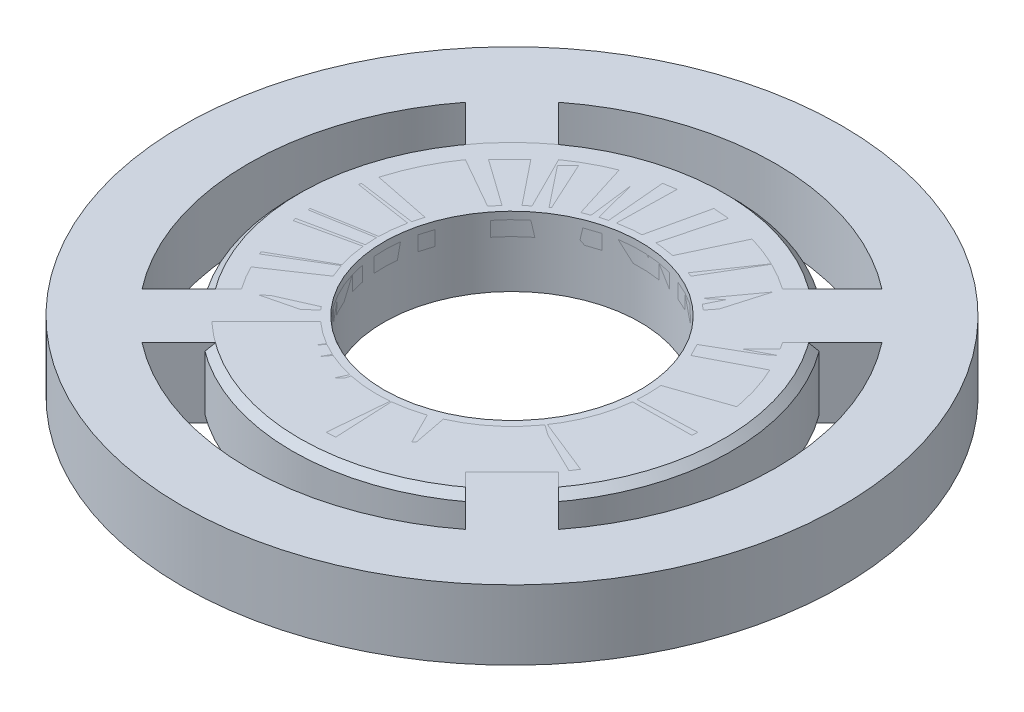
ISO-10303-21;
HEADER;
FILE_DESCRIPTION(('STEP AP214'),'2;1');
FILE_NAME('part.step','',(''),(''),'','','');
FILE_SCHEMA(('AUTOMOTIVE_DESIGN { 1 0 10303 214 1 1 1 1 }'));
ENDSEC;
DATA;
#1=APPLICATION_CONTEXT('core data for automotive mechanical design processes');
#2=APPLICATION_PROTOCOL_DEFINITION('international standard','automotive_design',2000,#1);
#3=PRODUCT_CONTEXT('',#1,'mechanical');
#4=PRODUCT('Part','Part','',(#3));
#5=PRODUCT_RELATED_PRODUCT_CATEGORY('part','',(#4));
#6=PRODUCT_DEFINITION_FORMATION('','',#4);
#7=PRODUCT_DEFINITION_CONTEXT('part definition',#1,'design');
#8=PRODUCT_DEFINITION('design','',#6,#7);
#9=PRODUCT_DEFINITION_SHAPE('','',#8);
#10=(LENGTH_UNIT() NAMED_UNIT(*) SI_UNIT(.MILLI.,.METRE.));
#11=(NAMED_UNIT(*) PLANE_ANGLE_UNIT() SI_UNIT($,.RADIAN.));
#12=(NAMED_UNIT(*) SI_UNIT($,.STERADIAN.) SOLID_ANGLE_UNIT());
#13=UNCERTAINTY_MEASURE_WITH_UNIT(LENGTH_MEASURE(1.E-05),#10,'distance_accuracy_value','');
#14=(GEOMETRIC_REPRESENTATION_CONTEXT(3) GLOBAL_UNCERTAINTY_ASSIGNED_CONTEXT((#13)) GLOBAL_UNIT_ASSIGNED_CONTEXT((#10,
#11,#12)) REPRESENTATION_CONTEXT('',''));
#15=CARTESIAN_POINT('',(0.,0.,0.));
#16=DIRECTION('',(0.,0.,1.));
#17=DIRECTION('',(1.,0.,0.));
#18=AXIS2_PLACEMENT_3D('',#15,#16,#17);
#19=CARTESIAN_POINT('',(0.,3.,0.));
#20=DIRECTION('',(0.,1.,0.));
#21=DIRECTION('',(0.,0.,1.));
#22=AXIS2_PLACEMENT_3D('',#19,#20,#21);
#23=PLANE('',#22);
#24=CARTESIAN_POINT('',(0.,3.,0.));
#25=DIRECTION('',(0.,1.,0.));
#26=DIRECTION('',(0.,0.,1.));
#27=AXIS2_PLACEMENT_3D('',#24,#25,#26);
#28=CIRCLE('',#27,17.5);
#29=CARTESIAN_POINT('',(0.,3.,17.5));
#30=VERTEX_POINT('',#29);
#31=EDGE_CURVE('E95',#30,#30,#28,.T.);
#32=ORIENTED_EDGE('',*,*,#31,.F.);
#33=EDGE_LOOP('',(#32));
#34=FACE_BOUND('',#33,.T.);
#35=CARTESIAN_POINT('',(0.,3.,0.));
#36=DIRECTION('',(0.,1.,0.));
#37=DIRECTION('',(0.,0.,1.));
#38=AXIS2_PLACEMENT_3D('',#35,#36,#37);
#39=CIRCLE('',#38,25.);
#40=CARTESIAN_POINT('',(0.,3.,25.));
#41=VERTEX_POINT('',#40);
#42=EDGE_CURVE('E92',#41,#41,#39,.F.);
#43=ORIENTED_EDGE('',*,*,#42,.F.);
#44=EDGE_LOOP('',(#43));
#45=FACE_BOUND('',#44,.T.);
#46=ADVANCED_FACE('F59',(#34,#45),#23,.T.);
#47=CARTESIAN_POINT('',(0.,0.,0.));
#48=DIRECTION('',(0.,1.,0.));
#49=DIRECTION('',(0.,0.,1.));
#50=AXIS2_PLACEMENT_3D('',#47,#48,#49);
#51=PLANE('',#50);
#52=CARTESIAN_POINT('',(0.,0.,0.));
#53=DIRECTION('',(0.,1.,0.));
#54=DIRECTION('',(0.,0.,1.));
#55=AXIS2_PLACEMENT_3D('',#52,#53,#54);
#56=CIRCLE('',#55,18.5);
#57=CARTESIAN_POINT('',(0.,0.,18.5));
#58=VERTEX_POINT('',#57);
#59=EDGE_CURVE('E75',#58,#58,#56,.T.);
#60=ORIENTED_EDGE('',*,*,#59,.T.);
#61=EDGE_LOOP('',(#60));
#62=FACE_BOUND('',#61,.T.);
#63=CARTESIAN_POINT('',(0.,0.,0.));
#64=DIRECTION('',(0.,1.,0.));
#65=DIRECTION('',(0.,0.,1.));
#66=AXIS2_PLACEMENT_3D('',#63,#64,#65);
#67=CIRCLE('',#66,29.);
#68=CARTESIAN_POINT('',(0.,0.,29.));
#69=VERTEX_POINT('',#68);
#70=EDGE_CURVE('E80',#69,#69,#67,.F.);
#71=ORIENTED_EDGE('',*,*,#70,.T.);
#72=EDGE_LOOP('',(#71));
#73=FACE_BOUND('',#72,.T.);
#74=ADVANCED_FACE('F123',(#62,#73),#51,.F.);
#75=CARTESIAN_POINT('',(0.,3.,0.));
#76=DIRECTION('',(0.,-1.,0.));
#77=DIRECTION('',(0.,0.,-1.));
#78=AXIS2_PLACEMENT_3D('',#75,#76,#77);
#79=CYLINDRICAL_SURFACE('',#78,30.);
#80=CARTESIAN_POINT('',(0.,1.00000000000001,0.));
#81=DIRECTION('',(0.,1.,0.));
#82=DIRECTION('',(0.,0.,1.));
#83=AXIS2_PLACEMENT_3D('',#80,#81,#82);
#84=CIRCLE('',#83,30.);
#85=CARTESIAN_POINT('',(0.,1.00000000000001,30.));
#86=VERTEX_POINT('',#85);
#87=EDGE_CURVE('E83',#86,#86,#84,.T.);
#88=ORIENTED_EDGE('',*,*,#87,.T.);
#89=EDGE_LOOP('',(#88));
#90=FACE_BOUND('',#89,.T.);
#91=CARTESIAN_POINT('',(0.,8.5,0.));
#92=DIRECTION('',(0.,1.,0.));
#93=DIRECTION('',(0.,0.,1.));
#94=AXIS2_PLACEMENT_3D('',#91,#92,#93);
#95=CIRCLE('',#94,30.);
#96=CARTESIAN_POINT('',(0.,8.5,30.));
#97=VERTEX_POINT('',#96);
#98=EDGE_CURVE('E86',#97,#97,#95,.F.);
#99=ORIENTED_EDGE('',*,*,#98,.T.);
#100=EDGE_LOOP('',(#99));
#101=FACE_BOUND('',#100,.T.);
#102=ADVANCED_FACE('F130',(#90,#101),#79,.T.);
#103=CARTESIAN_POINT('',(0.,3.,0.));
#104=DIRECTION('',(0.,-1.,0.));
#105=DIRECTION('',(0.,0.,-1.));
#106=AXIS2_PLACEMENT_3D('',#103,#104,#105);
#107=CYLINDRICAL_SURFACE('',#106,17.5);
#108=CARTESIAN_POINT('',(0.,0.999999999999994,0.));
#109=DIRECTION('',(0.,1.,0.));
#110=DIRECTION('',(0.,0.,1.));
#111=AXIS2_PLACEMENT_3D('',#108,#109,#110);
#112=CIRCLE('',#111,17.5);
#113=CARTESIAN_POINT('',(0.,0.999999999999994,17.5));
#114=VERTEX_POINT('',#113);
#115=EDGE_CURVE('E71',#114,#114,#112,.F.);
#116=ORIENTED_EDGE('',*,*,#115,.T.);
#117=EDGE_LOOP('',(#116));
#118=FACE_BOUND('',#117,.T.);
#119=ORIENTED_EDGE('',*,*,#31,.T.);
#120=EDGE_LOOP('',(#119));
#121=FACE_BOUND('',#120,.T.);
#122=ADVANCED_FACE('F136',(#118,#121),#107,.F.);
#123=CARTESIAN_POINT('',(0.,6.5,0.));
#124=DIRECTION('',(0.,-1.,0.));
#125=DIRECTION('',(0.,0.,-1.));
#126=AXIS2_PLACEMENT_3D('',#123,#124,#125);
#127=CYLINDRICAL_SURFACE('',#126,25.);
#128=CARTESIAN_POINT('',(0.,6.5,0.));
#129=DIRECTION('',(0.,1.,0.));
#130=DIRECTION('',(0.,0.,1.));
#131=AXIS2_PLACEMENT_3D('',#128,#129,#130);
#132=CIRCLE('',#131,25.);
#133=CARTESIAN_POINT('',(0.,6.5,25.));
#134=VERTEX_POINT('',#133);
#135=EDGE_CURVE('E98',#134,#134,#132,.T.);
#136=ORIENTED_EDGE('',*,*,#135,.T.);
#137=EDGE_LOOP('',(#136));
#138=FACE_BOUND('',#137,.T.);
#139=ORIENTED_EDGE('',*,*,#42,.T.);
#140=EDGE_LOOP('',(#139));
#141=FACE_BOUND('',#140,.T.);
#142=ADVANCED_FACE('F174',(#138,#141),#127,.F.);
#143=CARTESIAN_POINT('',(0.,6.5,0.));
#144=DIRECTION('',(0.,1.,0.));
#145=DIRECTION('',(0.,0.,1.));
#146=AXIS2_PLACEMENT_3D('',#143,#144,#145);
#147=PLANE('',#146);
#148=CARTESIAN_POINT('',(0.,6.5,0.));
#149=DIRECTION('',(0.,1.,0.));
#150=DIRECTION('',(0.,0.,1.));
#151=AXIS2_PLACEMENT_3D('',#148,#149,#150);
#152=CIRCLE('',#151,17.5);
#153=CARTESIAN_POINT('',(0.,6.5,17.5));
#154=VERTEX_POINT('',#153);
#155=EDGE_CURVE('E101',#154,#154,#152,.T.);
#156=ORIENTED_EDGE('',*,*,#155,.T.);
#157=EDGE_LOOP('',(#156));
#158=FACE_BOUND('',#157,.T.);
#159=ORIENTED_EDGE('',*,*,#135,.F.);
#160=EDGE_LOOP('',(#159));
#161=FACE_BOUND('',#160,.T.);
#162=ADVANCED_FACE('F105',(#158,#161),#147,.F.);
#163=CARTESIAN_POINT('',(0.,9.5,0.));
#164=DIRECTION('',(0.,1.,0.));
#165=DIRECTION('',(0.,0.,1.));
#166=AXIS2_PLACEMENT_3D('',#163,#164,#165);
#167=PLANE('',#166);
#168=CARTESIAN_POINT('',(0.,9.5,0.));
#169=DIRECTION('',(0.,1.,0.));
#170=DIRECTION('',(0.,0.,1.));
#171=AXIS2_PLACEMENT_3D('',#168,#169,#170);
#172=CIRCLE('',#171,18.5);
#173=CARTESIAN_POINT('',(0.,9.5,18.5));
#174=VERTEX_POINT('',#173);
#175=EDGE_CURVE('E11',#174,#174,#172,.F.);
#176=ORIENTED_EDGE('',*,*,#175,.T.);
#177=EDGE_LOOP('',(#176));
#178=FACE_BOUND('',#177,.T.);
#179=CARTESIAN_POINT('',(0.,9.5,0.));
#180=DIRECTION('',(0.,1.,0.));
#181=DIRECTION('',(0.,0.,1.));
#182=AXIS2_PLACEMENT_3D('',#179,#180,#181);
#183=CIRCLE('',#182,29.);
#184=CARTESIAN_POINT('',(0.,9.5,29.));
#185=VERTEX_POINT('',#184);
#186=EDGE_CURVE('E89',#185,#185,#183,.T.);
#187=ORIENTED_EDGE('',*,*,#186,.T.);
#188=EDGE_LOOP('',(#187));
#189=FACE_BOUND('',#188,.T.);
#190=ADVANCED_FACE('F111',(#178,#189),#167,.T.);
#191=CARTESIAN_POINT('',(0.,9.5,0.));
#192=DIRECTION('',(0.,-1.,0.));
#193=DIRECTION('',(0.,0.,-1.));
#194=AXIS2_PLACEMENT_3D('',#191,#192,#193);
#195=CYLINDRICAL_SURFACE('',#194,17.5);
#196=CARTESIAN_POINT('',(0.,8.50000000000001,0.));
#197=DIRECTION('',(0.,1.,0.));
#198=DIRECTION('',(0.,0.,1.));
#199=AXIS2_PLACEMENT_3D('',#196,#197,#198);
#200=CIRCLE('',#199,17.5);
#201=CARTESIAN_POINT('',(0.,8.50000000000001,17.5));
#202=VERTEX_POINT('',#201);
#203=EDGE_CURVE('E67',#202,#202,#200,.T.);
#204=ORIENTED_EDGE('',*,*,#203,.T.);
#205=EDGE_LOOP('',(#204));
#206=FACE_BOUND('',#205,.T.);
#207=ORIENTED_EDGE('',*,*,#155,.F.);
#208=EDGE_LOOP('',(#207));
#209=FACE_BOUND('',#208,.T.);
#210=ADVANCED_FACE('F108',(#206,#209),#195,.F.);
#211=CARTESIAN_POINT('',(0.,9.5,0.));
#212=DIRECTION('',(0.,-1.,0.));
#213=DIRECTION('',(0.,0.,-1.));
#214=AXIS2_PLACEMENT_3D('',#211,#212,#213);
#215=CONICAL_SURFACE('',#214,29.,0.785398163397454);
#216=ORIENTED_EDGE('',*,*,#98,.F.);
#217=EDGE_LOOP('',(#216));
#218=FACE_BOUND('',#217,.T.);
#219=ORIENTED_EDGE('',*,*,#186,.F.);
#220=EDGE_LOOP('',(#219));
#221=FACE_BOUND('',#220,.T.);
#222=ADVANCED_FACE('F110',(#218,#221),#215,.T.);
#223=CARTESIAN_POINT('',(0.,1.00000000000001,0.));
#224=DIRECTION('',(0.,1.,0.));
#225=DIRECTION('',(0.,0.,1.));
#226=AXIS2_PLACEMENT_3D('',#223,#224,#225);
#227=CONICAL_SURFACE('',#226,30.,0.785398163397448);
#228=ORIENTED_EDGE('',*,*,#70,.F.);
#229=EDGE_LOOP('',(#228));
#230=FACE_BOUND('',#229,.T.);
#231=ORIENTED_EDGE('',*,*,#87,.F.);
#232=EDGE_LOOP('',(#231));
#233=FACE_BOUND('',#232,.T.);
#234=ADVANCED_FACE('F118',(#230,#233),#227,.T.);
#235=CARTESIAN_POINT('',(0.,0.,0.));
#236=DIRECTION('',(0.,-1.,0.));
#237=DIRECTION('',(0.,0.,-1.));
#238=AXIS2_PLACEMENT_3D('',#235,#236,#237);
#239=CONICAL_SURFACE('',#238,18.5,0.78539816339745);
#240=ORIENTED_EDGE('',*,*,#115,.F.);
#241=EDGE_LOOP('',(#240));
#242=FACE_BOUND('',#241,.T.);
#243=ORIENTED_EDGE('',*,*,#59,.F.);
#244=EDGE_LOOP('',(#243));
#245=FACE_BOUND('',#244,.T.);
#246=ADVANCED_FACE('F150',(#242,#245),#239,.F.);
#247=CARTESIAN_POINT('',(0.,8.50000000000001,0.));
#248=DIRECTION('',(0.,1.,0.));
#249=DIRECTION('',(0.,0.,1.));
#250=AXIS2_PLACEMENT_3D('',#247,#248,#249);
#251=CONICAL_SURFACE('',#250,17.5,0.785398163397453);
#252=ORIENTED_EDGE('',*,*,#175,.F.);
#253=EDGE_LOOP('',(#252));
#254=FACE_BOUND('',#253,.T.);
#255=ORIENTED_EDGE('',*,*,#203,.F.);
#256=EDGE_LOOP('',(#255));
#257=FACE_BOUND('',#256,.T.);
#258=ADVANCED_FACE('F62',(#254,#257),#251,.F.);
#259=CLOSED_SHELL('',(#46,#74,#102,#122,#142,#162,#190,#210,#222,#234,#246,#258));
#260=MANIFOLD_SOLID_BREP('B2',#259);
#261=CARTESIAN_POINT('',(0.,9.5,0.));
#262=DIRECTION('',(0.,-1.,0.));
#263=DIRECTION('',(0.,0.,-1.));
#264=AXIS2_PLACEMENT_3D('',#261,#262,#263);
#265=CYLINDRICAL_SURFACE('',#264,26.5);
#266=CARTESIAN_POINT('',(0.,0.,0.));
#267=DIRECTION('',(0.,1.,0.));
#268=DIRECTION('',(0.,0.,1.));
#269=AXIS2_PLACEMENT_3D('',#266,#267,#268);
#270=CIRCLE('',#269,26.5);
#271=CARTESIAN_POINT('',(21.6481658279593,0.,15.2842047972792));
#272=VERTEX_POINT('',#271);
#273=CARTESIAN_POINT('',(21.6481658279582,0.,-15.2842047972808));
#274=VERTEX_POINT('',#273);
#275=EDGE_CURVE('E446',#272,#274,#270,.T.);
#276=ORIENTED_EDGE('',*,*,#275,.T.);
#277=DIRECTION('',(0.,-1.,0.));
#278=VECTOR('',#277,1.);
#279=CARTESIAN_POINT('',(21.6481658279582,9.5,-15.2842047972808));
#280=LINE('',#279,#278);
#281=CARTESIAN_POINT('',(21.6481658279582,9.5,-15.2842047972808));
#282=VERTEX_POINT('',#281);
#283=EDGE_CURVE('E57',#282,#274,#280,.T.);
#284=ORIENTED_EDGE('',*,*,#283,.F.);
#285=CARTESIAN_POINT('',(0.,9.5,0.));
#286=DIRECTION('',(0.,1.,0.));
#287=DIRECTION('',(0.,0.,1.));
#288=AXIS2_PLACEMENT_3D('',#285,#286,#287);
#289=CIRCLE('',#288,26.5);
#290=CARTESIAN_POINT('',(21.6481658279593,9.5,15.2842047972792));
#291=VERTEX_POINT('',#290);
#292=EDGE_CURVE('E390',#291,#282,#289,.T.);
#293=ORIENTED_EDGE('',*,*,#292,.F.);
#294=DIRECTION('',(0.,-1.,0.));
#295=VECTOR('',#294,1.);
#296=CARTESIAN_POINT('',(21.6481658279593,9.5,15.2842047972792));
#297=LINE('',#296,#295);
#298=EDGE_CURVE('E280',#291,#272,#297,.T.);
#299=ORIENTED_EDGE('',*,*,#298,.T.);
#300=EDGE_LOOP('',(#276,#284,#293,#299));
#301=FACE_BOUND('',#300,.T.);
#302=ADVANCED_FACE('F261',(#301),#265,.T.);
#303=CARTESIAN_POINT('',(3.18198051533949,9.5,3.18198051533927));
#304=DIRECTION('',(-0.707106781186573,0.,-0.707106781186522));
#305=DIRECTION('',(-0.707106781186522,0.,0.707106781186573));
#306=AXIS2_PLACEMENT_3D('',#303,#304,#305);
#307=PLANE('',#306);
#308=DIRECTION('',(0.707106781186522,0.,-0.707106781186573));
#309=VECTOR('',#308,1.);
#310=CARTESIAN_POINT('',(3.18198051533949,0.,3.18198051533927));
#311=LINE('',#310,#309);
#312=CARTESIAN_POINT('',(28.4381678760627,0.,-22.0742068453857));
#313=VERTEX_POINT('',#312);
#314=EDGE_CURVE('E396',#274,#313,#311,.T.);
#315=ORIENTED_EDGE('',*,*,#314,.T.);
#316=DIRECTION('',(0.,-1.,0.));
#317=VECTOR('',#316,1.);
#318=CARTESIAN_POINT('',(28.4381678760627,9.5,-22.0742068453857));
#319=LINE('',#318,#317);
#320=CARTESIAN_POINT('',(28.4381678760627,9.5,-22.0742068453857));
#321=VERTEX_POINT('',#320);
#322=EDGE_CURVE('E271',#321,#313,#319,.T.);
#323=ORIENTED_EDGE('',*,*,#322,.F.);
#324=DIRECTION('',(0.707106781186522,0.,-0.707106781186573));
#325=VECTOR('',#324,1.);
#326=CARTESIAN_POINT('',(3.18198051533949,9.5,3.18198051533927));
#327=LINE('',#326,#325);
#328=EDGE_CURVE('E383',#282,#321,#327,.T.);
#329=ORIENTED_EDGE('',*,*,#328,.F.);
#330=ORIENTED_EDGE('',*,*,#283,.T.);
#331=EDGE_LOOP('',(#315,#323,#329,#330));
#332=FACE_BOUND('',#331,.T.);
#333=ADVANCED_FACE('F395',(#332),#307,.F.);
#334=CARTESIAN_POINT('',(0.,9.5,0.));
#335=DIRECTION('',(0.,-1.,0.));
#336=DIRECTION('',(0.,0.,-1.));
#337=AXIS2_PLACEMENT_3D('',#334,#335,#336);
#338=CYLINDRICAL_SURFACE('',#337,36.);
#339=CARTESIAN_POINT('',(0.,0.,0.));
#340=DIRECTION('',(0.,1.,0.));
#341=DIRECTION('',(0.,0.,1.));
#342=AXIS2_PLACEMENT_3D('',#339,#340,#341);
#343=CIRCLE('',#342,36.);
#344=CARTESIAN_POINT('',(28.4381678760643,0.,22.0742068453837));
#345=VERTEX_POINT('',#344);
#346=EDGE_CURVE('E454',#345,#313,#343,.T.);
#347=ORIENTED_EDGE('',*,*,#346,.F.);
#348=DIRECTION('',(0.,-1.,0.));
#349=VECTOR('',#348,1.);
#350=CARTESIAN_POINT('',(28.4381678760643,9.5,22.0742068453837));
#351=LINE('',#350,#349);
#352=CARTESIAN_POINT('',(28.4381678760643,9.5,22.0742068453837));
#353=VERTEX_POINT('',#352);
#354=EDGE_CURVE('E330',#353,#345,#351,.T.);
#355=ORIENTED_EDGE('',*,*,#354,.F.);
#356=CARTESIAN_POINT('',(0.,9.5,0.));
#357=DIRECTION('',(0.,1.,0.));
#358=DIRECTION('',(0.,0.,1.));
#359=AXIS2_PLACEMENT_3D('',#356,#357,#358);
#360=CIRCLE('',#359,36.);
#361=EDGE_CURVE('E389',#353,#321,#360,.T.);
#362=ORIENTED_EDGE('',*,*,#361,.T.);
#363=ORIENTED_EDGE('',*,*,#322,.T.);
#364=EDGE_LOOP('',(#347,#355,#362,#363));
#365=FACE_BOUND('',#364,.T.);
#366=ADVANCED_FACE('F400',(#365),#338,.F.);
#367=CARTESIAN_POINT('',(-3.1819805153395,9.5,-3.18198051533927));
#368=DIRECTION('',(-0.707106781186573,0.,-0.707106781186522));
#369=DIRECTION('',(-0.707106781186522,0.,0.707106781186573));
#370=AXIS2_PLACEMENT_3D('',#367,#368,#369);
#371=PLANE('',#370);
#372=DIRECTION('',(0.707106781186522,0.,-0.707106781186573));
#373=VECTOR('',#372,1.);
#374=CARTESIAN_POINT('',(-3.1819805153395,0.,-3.18198051533927));
#375=LINE('',#374,#373);
#376=CARTESIAN_POINT('',(15.2842047972792,0.,-21.6481658279593));
#377=VERTEX_POINT('',#376);
#378=CARTESIAN_POINT('',(22.0742068453837,0.,-28.4381678760643));
#379=VERTEX_POINT('',#378);
#380=EDGE_CURVE('E461',#377,#379,#375,.T.);
#381=ORIENTED_EDGE('',*,*,#380,.F.);
#382=DIRECTION('',(0.,-1.,0.));
#383=VECTOR('',#382,1.);
#384=CARTESIAN_POINT('',(15.2842047972792,9.5,-21.6481658279593));
#385=LINE('',#384,#383);
#386=CARTESIAN_POINT('',(15.2842047972792,9.5,-21.6481658279593));
#387=VERTEX_POINT('',#386);
#388=EDGE_CURVE('E481',#387,#377,#385,.T.);
#389=ORIENTED_EDGE('',*,*,#388,.F.);
#390=DIRECTION('',(0.707106781186522,0.,-0.707106781186573));
#391=VECTOR('',#390,1.);
#392=CARTESIAN_POINT('',(-3.1819805153395,9.5,-3.18198051533927));
#393=LINE('',#392,#391);
#394=CARTESIAN_POINT('',(22.0742068453837,9.5,-28.4381678760643));
#395=VERTEX_POINT('',#394);
#396=EDGE_CURVE('E420',#387,#395,#393,.T.);
#397=ORIENTED_EDGE('',*,*,#396,.T.);
#398=DIRECTION('',(0.,-1.,0.));
#399=VECTOR('',#398,1.);
#400=CARTESIAN_POINT('',(22.0742068453837,9.5,-28.4381678760643));
#401=LINE('',#400,#399);
#402=EDGE_CURVE('E483',#395,#379,#401,.T.);
#403=ORIENTED_EDGE('',*,*,#402,.T.);
#404=EDGE_LOOP('',(#381,#389,#397,#403));
#405=FACE_BOUND('',#404,.T.);
#406=ADVANCED_FACE('F540',(#405),#371,.T.);
#407=CARTESIAN_POINT('',(-15.284204797281,0.,-21.6481658279581));
#408=VERTEX_POINT('',#407);
#409=EDGE_CURVE('E464',#377,#408,#270,.T.);
#410=ORIENTED_EDGE('',*,*,#409,.T.);
#411=DIRECTION('',(0.,-1.,0.));
#412=VECTOR('',#411,1.);
#413=CARTESIAN_POINT('',(-15.284204797281,9.5,-21.6481658279581));
#414=LINE('',#413,#412);
#415=CARTESIAN_POINT('',(-15.284204797281,9.5,-21.6481658279581));
#416=VERTEX_POINT('',#415);
#417=EDGE_CURVE('E488',#416,#408,#414,.T.);
#418=ORIENTED_EDGE('',*,*,#417,.F.);
#419=EDGE_CURVE('E425',#387,#416,#289,.T.);
#420=ORIENTED_EDGE('',*,*,#419,.F.);
#421=ORIENTED_EDGE('',*,*,#388,.T.);
#422=EDGE_LOOP('',(#410,#418,#420,#421));
#423=FACE_BOUND('',#422,.T.);
#424=ADVANCED_FACE('F532',(#423),#265,.T.);
#425=CARTESIAN_POINT('',(3.18198051533926,9.5,-3.18198051533957));
#426=DIRECTION('',(-0.707106781186514,0.,0.707106781186581));
#427=DIRECTION('',(0.707106781186581,0.,0.707106781186514));
#428=AXIS2_PLACEMENT_3D('',#425,#426,#427);
#429=PLANE('',#428);
#430=DIRECTION('',(-0.707106781186581,0.,-0.707106781186514));
#431=VECTOR('',#430,1.);
#432=CARTESIAN_POINT('',(3.18198051533926,0.,-3.18198051533957));
#433=LINE('',#432,#431);
#434=CARTESIAN_POINT('',(-22.0742068453861,0.,-28.4381678760625));
#435=VERTEX_POINT('',#434);
#436=EDGE_CURVE('E465',#408,#435,#433,.T.);
#437=ORIENTED_EDGE('',*,*,#436,.T.);
#438=DIRECTION('',(0.,-1.,0.));
#439=VECTOR('',#438,1.);
#440=CARTESIAN_POINT('',(-22.0742068453861,9.5,-28.4381678760625));
#441=LINE('',#440,#439);
#442=CARTESIAN_POINT('',(-22.0742068453861,9.5,-28.4381678760625));
#443=VERTEX_POINT('',#442);
#444=EDGE_CURVE('E485',#443,#435,#441,.T.);
#445=ORIENTED_EDGE('',*,*,#444,.F.);
#446=DIRECTION('',(-0.707106781186581,0.,-0.707106781186514));
#447=VECTOR('',#446,1.);
#448=CARTESIAN_POINT('',(3.18198051533926,9.5,-3.18198051533957));
#449=LINE('',#448,#447);
#450=EDGE_CURVE('E410',#416,#443,#449,.T.);
#451=ORIENTED_EDGE('',*,*,#450,.F.);
#452=ORIENTED_EDGE('',*,*,#417,.T.);
#453=EDGE_LOOP('',(#437,#445,#451,#452));
#454=FACE_BOUND('',#453,.T.);
#455=ADVANCED_FACE('F539',(#454),#429,.F.);
#456=CARTESIAN_POINT('',(-3.18198051533937,9.5,3.18198051533967));
#457=DIRECTION('',(0.707106781186514,0.,-0.707106781186581));
#458=DIRECTION('',(-0.707106781186581,0.,-0.707106781186514));
#459=AXIS2_PLACEMENT_3D('',#456,#457,#458);
#460=PLANE('',#459);
#461=DIRECTION('',(0.707106781186581,0.,0.707106781186514));
#462=VECTOR('',#461,1.);
#463=CARTESIAN_POINT('',(-3.18198051533937,0.,3.18198051533967));
#464=LINE('',#463,#462);
#465=CARTESIAN_POINT('',(-28.4381678760647,0.,-22.0742068453832));
#466=VERTEX_POINT('',#465);
#467=CARTESIAN_POINT('',(-21.6481658279596,0.,-15.2842047972788));
#468=VERTEX_POINT('',#467);
#469=EDGE_CURVE('E453',#466,#468,#464,.T.);
#470=ORIENTED_EDGE('',*,*,#469,.T.);
#471=DIRECTION('',(0.,-1.,0.));
#472=VECTOR('',#471,1.);
#473=CARTESIAN_POINT('',(-21.6481658279596,9.5,-15.2842047972788));
#474=LINE('',#473,#472);
#475=CARTESIAN_POINT('',(-21.6481658279596,9.5,-15.2842047972788));
#476=VERTEX_POINT('',#475);
#477=EDGE_CURVE('E486',#476,#468,#474,.T.);
#478=ORIENTED_EDGE('',*,*,#477,.F.);
#479=DIRECTION('',(0.707106781186581,0.,0.707106781186514));
#480=VECTOR('',#479,1.);
#481=CARTESIAN_POINT('',(-3.18198051533937,9.5,3.18198051533967));
#482=LINE('',#481,#480);
#483=CARTESIAN_POINT('',(-28.4381678760647,9.5,-22.0742068453832));
#484=VERTEX_POINT('',#483);
#485=EDGE_CURVE('E413',#484,#476,#482,.T.);
#486=ORIENTED_EDGE('',*,*,#485,.F.);
#487=DIRECTION('',(0.,-1.,0.));
#488=VECTOR('',#487,1.);
#489=CARTESIAN_POINT('',(-28.4381678760647,9.5,-22.0742068453832));
#490=LINE('',#489,#488);
#491=EDGE_CURVE('E492',#484,#466,#490,.T.);
#492=ORIENTED_EDGE('',*,*,#491,.T.);
#493=EDGE_LOOP('',(#470,#478,#486,#492));
#494=FACE_BOUND('',#493,.T.);
#495=ADVANCED_FACE('F546',(#494),#460,.F.);
#496=CARTESIAN_POINT('',(-21.6481658279581,0.,15.284204797281));
#497=VERTEX_POINT('',#496);
#498=EDGE_CURVE('E447',#468,#497,#270,.T.);
#499=ORIENTED_EDGE('',*,*,#498,.T.);
#500=DIRECTION('',(0.,-1.,0.));
#501=VECTOR('',#500,1.);
#502=CARTESIAN_POINT('',(-21.6481658279581,9.5,15.284204797281));
#503=LINE('',#502,#501);
#504=CARTESIAN_POINT('',(-21.6481658279581,9.5,15.284204797281));
#505=VERTEX_POINT('',#504);
#506=EDGE_CURVE('E496',#505,#497,#503,.T.);
#507=ORIENTED_EDGE('',*,*,#506,.F.);
#508=EDGE_CURVE('E418',#476,#505,#289,.T.);
#509=ORIENTED_EDGE('',*,*,#508,.F.);
#510=ORIENTED_EDGE('',*,*,#477,.T.);
#511=EDGE_LOOP('',(#499,#507,#509,#510));
#512=FACE_BOUND('',#511,.T.);
#513=ADVANCED_FACE('F529',(#512),#265,.T.);
#514=CARTESIAN_POINT('',(-3.18198051533962,9.5,-3.1819805153393));
#515=DIRECTION('',(-0.707106781186583,0.,-0.707106781186512));
#516=DIRECTION('',(-0.707106781186512,0.,0.707106781186583));
#517=AXIS2_PLACEMENT_3D('',#514,#515,#516);
#518=PLANE('',#517);
#519=DIRECTION('',(0.707106781186512,0.,-0.707106781186583));
#520=VECTOR('',#519,1.);
#521=CARTESIAN_POINT('',(-3.18198051533962,0.,-3.1819805153393));
#522=LINE('',#521,#520);
#523=CARTESIAN_POINT('',(-28.4381678760625,0.,22.0742068453861));
#524=VERTEX_POINT('',#523);
#525=EDGE_CURVE('E458',#524,#497,#522,.T.);
#526=ORIENTED_EDGE('',*,*,#525,.F.);
#527=DIRECTION('',(0.,-1.,0.));
#528=VECTOR('',#527,1.);
#529=CARTESIAN_POINT('',(-28.4381678760625,9.5,22.0742068453861));
#530=LINE('',#529,#528);
#531=CARTESIAN_POINT('',(-28.4381678760625,9.5,22.0742068453861));
#532=VERTEX_POINT('',#531);
#533=EDGE_CURVE('E494',#532,#524,#530,.T.);
#534=ORIENTED_EDGE('',*,*,#533,.F.);
#535=DIRECTION('',(0.707106781186512,0.,-0.707106781186583));
#536=VECTOR('',#535,1.);
#537=CARTESIAN_POINT('',(-3.18198051533962,9.5,-3.1819805153393));
#538=LINE('',#537,#536);
#539=EDGE_CURVE('E421',#532,#505,#538,.T.);
#540=ORIENTED_EDGE('',*,*,#539,.T.);
#541=ORIENTED_EDGE('',*,*,#506,.T.);
#542=EDGE_LOOP('',(#526,#534,#540,#541));
#543=FACE_BOUND('',#542,.T.);
#544=ADVANCED_FACE('F552',(#543),#518,.T.);
#545=CARTESIAN_POINT('',(3.18198051533963,9.5,3.18198051533931));
#546=DIRECTION('',(-0.707106781186583,0.,-0.707106781186512));
#547=DIRECTION('',(-0.707106781186512,0.,0.707106781186583));
#548=AXIS2_PLACEMENT_3D('',#545,#546,#547);
#549=PLANE('',#548);
#550=DIRECTION('',(0.707106781186512,0.,-0.707106781186583));
#551=VECTOR('',#550,1.);
#552=CARTESIAN_POINT('',(3.18198051533963,0.,3.18198051533931));
#553=LINE('',#552,#551);
#554=CARTESIAN_POINT('',(-22.0742068453832,0.,28.4381678760647));
#555=VERTEX_POINT('',#554);
#556=CARTESIAN_POINT('',(-15.2842047972788,0.,21.6481658279596));
#557=VERTEX_POINT('',#556);
#558=EDGE_CURVE('E440',#555,#557,#553,.T.);
#559=ORIENTED_EDGE('',*,*,#558,.T.);
#560=DIRECTION('',(0.,-1.,0.));
#561=VECTOR('',#560,1.);
#562=CARTESIAN_POINT('',(-15.2842047972788,9.5,21.6481658279596));
#563=LINE('',#562,#561);
#564=CARTESIAN_POINT('',(-15.2842047972788,9.5,21.6481658279596));
#565=VERTEX_POINT('',#564);
#566=EDGE_CURVE('E265',#565,#557,#563,.T.);
#567=ORIENTED_EDGE('',*,*,#566,.F.);
#568=DIRECTION('',(0.707106781186512,0.,-0.707106781186583));
#569=VECTOR('',#568,1.);
#570=CARTESIAN_POINT('',(3.18198051533963,9.5,3.18198051533931));
#571=LINE('',#570,#569);
#572=CARTESIAN_POINT('',(-22.0742068453832,9.5,28.4381678760647));
#573=VERTEX_POINT('',#572);
#574=EDGE_CURVE('E479',#573,#565,#571,.T.);
#575=ORIENTED_EDGE('',*,*,#574,.F.);
#576=DIRECTION('',(0.,-1.,0.));
#577=VECTOR('',#576,1.);
#578=CARTESIAN_POINT('',(-22.0742068453832,9.5,28.4381678760647));
#579=LINE('',#578,#577);
#580=EDGE_CURVE('E439',#573,#555,#579,.T.);
#581=ORIENTED_EDGE('',*,*,#580,.T.);
#582=EDGE_LOOP('',(#559,#567,#575,#581));
#583=FACE_BOUND('',#582,.T.);
#584=ADVANCED_FACE('F263',(#583),#549,.F.);
#585=CARTESIAN_POINT('',(15.2842047972803,0.,21.6481658279586));
#586=VERTEX_POINT('',#585);
#587=EDGE_CURVE('E443',#557,#586,#270,.T.);
#588=ORIENTED_EDGE('',*,*,#587,.T.);
#589=DIRECTION('',(0.,-1.,0.));
#590=VECTOR('',#589,1.);
#591=CARTESIAN_POINT('',(15.2842047972803,9.5,21.6481658279586));
#592=LINE('',#591,#590);
#593=CARTESIAN_POINT('',(15.2842047972803,9.5,21.6481658279586));
#594=VERTEX_POINT('',#593);
#595=EDGE_CURVE('E502',#594,#586,#592,.T.);
#596=ORIENTED_EDGE('',*,*,#595,.F.);
#597=EDGE_CURVE('E343',#565,#594,#289,.T.);
#598=ORIENTED_EDGE('',*,*,#597,.F.);
#599=ORIENTED_EDGE('',*,*,#566,.T.);
#600=EDGE_LOOP('',(#588,#596,#598,#599));
#601=FACE_BOUND('',#600,.T.);
#602=ADVANCED_FACE('F508',(#601),#265,.T.);
#603=CARTESIAN_POINT('',(-3.1819805153397,9.5,3.18198051533993));
#604=DIRECTION('',(0.707106781186522,0.,-0.707106781186573));
#605=DIRECTION('',(-0.707106781186573,0.,-0.707106781186522));
#606=AXIS2_PLACEMENT_3D('',#603,#604,#605);
#607=PLANE('',#606);
#608=DIRECTION('',(0.707106781186573,0.,0.707106781186522));
#609=VECTOR('',#608,1.);
#610=CARTESIAN_POINT('',(-3.1819805153397,0.,3.18198051533993));
#611=LINE('',#610,#609);
#612=CARTESIAN_POINT('',(22.0742068453853,0.,28.4381678760631));
#613=VERTEX_POINT('',#612);
#614=EDGE_CURVE('E445',#586,#613,#611,.T.);
#615=ORIENTED_EDGE('',*,*,#614,.T.);
#616=DIRECTION('',(0.,-1.,0.));
#617=VECTOR('',#616,1.);
#618=CARTESIAN_POINT('',(22.0742068453853,9.5,28.4381678760631));
#619=LINE('',#618,#617);
#620=CARTESIAN_POINT('',(22.0742068453853,9.5,28.4381678760631));
#621=VERTEX_POINT('',#620);
#622=EDGE_CURVE('E501',#621,#613,#619,.T.);
#623=ORIENTED_EDGE('',*,*,#622,.F.);
#624=DIRECTION('',(0.707106781186573,0.,0.707106781186522));
#625=VECTOR('',#624,1.);
#626=CARTESIAN_POINT('',(-3.1819805153397,9.5,3.18198051533993));
#627=LINE('',#626,#625);
#628=EDGE_CURVE('E414',#594,#621,#627,.T.);
#629=ORIENTED_EDGE('',*,*,#628,.F.);
#630=ORIENTED_EDGE('',*,*,#595,.T.);
#631=EDGE_LOOP('',(#615,#623,#629,#630));
#632=FACE_BOUND('',#631,.T.);
#633=ADVANCED_FACE('F518',(#632),#607,.F.);
#634=CARTESIAN_POINT('',(0.,9.5,0.));
#635=DIRECTION('',(0.,-1.,0.));
#636=DIRECTION('',(0.,0.,-1.));
#637=AXIS2_PLACEMENT_3D('',#634,#635,#636);
#638=CYLINDRICAL_SURFACE('',#637,45.);
#639=CARTESIAN_POINT('',(0.,9.5,0.));
#640=DIRECTION('',(0.,1.,0.));
#641=DIRECTION('',(0.,0.,1.));
#642=AXIS2_PLACEMENT_3D('',#639,#640,#641);
#643=CIRCLE('',#642,45.);
#644=CARTESIAN_POINT('',(0.,9.5,45.));
#645=VERTEX_POINT('',#644);
#646=EDGE_CURVE('E405',#645,#645,#643,.T.);
#647=ORIENTED_EDGE('',*,*,#646,.F.);
#648=EDGE_LOOP('',(#647));
#649=FACE_BOUND('',#648,.T.);
#650=CARTESIAN_POINT('',(0.,0.,0.));
#651=DIRECTION('',(0.,1.,0.));
#652=DIRECTION('',(0.,0.,1.));
#653=AXIS2_PLACEMENT_3D('',#650,#651,#652);
#654=CIRCLE('',#653,45.);
#655=CARTESIAN_POINT('',(0.,0.,45.));
#656=VERTEX_POINT('',#655);
#657=EDGE_CURVE('E473',#656,#656,#654,.T.);
#658=ORIENTED_EDGE('',*,*,#657,.T.);
#659=EDGE_LOOP('',(#658));
#660=FACE_BOUND('',#659,.T.);
#661=ADVANCED_FACE('F520',(#649,#660),#638,.T.);
#662=CARTESIAN_POINT('',(3.18198051533927,9.5,-3.1819805153395));
#663=DIRECTION('',(0.707106781186522,0.,-0.707106781186573));
#664=DIRECTION('',(-0.707106781186573,0.,-0.707106781186522));
#665=AXIS2_PLACEMENT_3D('',#662,#663,#664);
#666=PLANE('',#665);
#667=DIRECTION('',(0.707106781186573,0.,0.707106781186522));
#668=VECTOR('',#667,1.);
#669=CARTESIAN_POINT('',(3.18198051533927,0.,-3.1819805153395));
#670=LINE('',#669,#668);
#671=EDGE_CURVE('E470',#272,#345,#670,.T.);
#672=ORIENTED_EDGE('',*,*,#671,.F.);
#673=ORIENTED_EDGE('',*,*,#298,.F.);
#674=DIRECTION('',(0.707106781186573,0.,0.707106781186522));
#675=VECTOR('',#674,1.);
#676=CARTESIAN_POINT('',(3.18198051533927,9.5,-3.1819805153395));
#677=LINE('',#676,#675);
#678=EDGE_CURVE('E401',#291,#353,#677,.T.);
#679=ORIENTED_EDGE('',*,*,#678,.T.);
#680=ORIENTED_EDGE('',*,*,#354,.T.);
#681=EDGE_LOOP('',(#672,#673,#679,#680));
#682=FACE_BOUND('',#681,.T.);
#683=ADVANCED_FACE('F525',(#682),#666,.T.);
#684=EDGE_CURVE('E468',#379,#435,#343,.T.);
#685=ORIENTED_EDGE('',*,*,#684,.F.);
#686=ORIENTED_EDGE('',*,*,#402,.F.);
#687=EDGE_CURVE('E403',#395,#443,#360,.T.);
#688=ORIENTED_EDGE('',*,*,#687,.T.);
#689=ORIENTED_EDGE('',*,*,#444,.T.);
#690=EDGE_LOOP('',(#685,#686,#688,#689));
#691=FACE_BOUND('',#690,.T.);
#692=ADVANCED_FACE('F577',(#691),#338,.F.);
#693=EDGE_CURVE('E455',#466,#524,#343,.T.);
#694=ORIENTED_EDGE('',*,*,#693,.F.);
#695=ORIENTED_EDGE('',*,*,#491,.F.);
#696=EDGE_CURVE('E411',#484,#532,#360,.T.);
#697=ORIENTED_EDGE('',*,*,#696,.T.);
#698=ORIENTED_EDGE('',*,*,#533,.T.);
#699=EDGE_LOOP('',(#694,#695,#697,#698));
#700=FACE_BOUND('',#699,.T.);
#701=ADVANCED_FACE('F571',(#700),#338,.F.);
#702=EDGE_CURVE('E450',#555,#613,#343,.T.);
#703=ORIENTED_EDGE('',*,*,#702,.F.);
#704=ORIENTED_EDGE('',*,*,#580,.F.);
#705=EDGE_CURVE('E404',#573,#621,#360,.T.);
#706=ORIENTED_EDGE('',*,*,#705,.T.);
#707=ORIENTED_EDGE('',*,*,#622,.T.);
#708=EDGE_LOOP('',(#703,#704,#706,#707));
#709=FACE_BOUND('',#708,.T.);
#710=ADVANCED_FACE('F516',(#709),#338,.F.);
#711=CARTESIAN_POINT('',(0.,9.5,0.));
#712=DIRECTION('',(0.,-1.,0.));
#713=DIRECTION('',(0.,0.,-1.));
#714=AXIS2_PLACEMENT_3D('',#711,#712,#713);
#715=CYLINDRICAL_SURFACE('',#714,17.5);
#716=CARTESIAN_POINT('',(0.,9.5,0.));
#717=DIRECTION('',(0.,1.,0.));
#718=DIRECTION('',(0.,0.,1.));
#719=AXIS2_PLACEMENT_3D('',#716,#717,#718);
#720=CIRCLE('',#719,17.5);
#721=CARTESIAN_POINT('',(0.,9.5,17.5));
#722=VERTEX_POINT('',#721);
#723=EDGE_CURVE('E436',#722,#722,#720,.T.);
#724=ORIENTED_EDGE('',*,*,#723,.T.);
#725=EDGE_LOOP('',(#724));
#726=FACE_BOUND('',#725,.T.);
#727=CARTESIAN_POINT('',(0.,0.,0.));
#728=DIRECTION('',(0.,1.,0.));
#729=DIRECTION('',(0.,0.,1.));
#730=AXIS2_PLACEMENT_3D('',#727,#728,#729);
#731=CIRCLE('',#730,17.5);
#732=CARTESIAN_POINT('',(0.,0.,17.5));
#733=VERTEX_POINT('',#732);
#734=EDGE_CURVE('E476',#733,#733,#731,.T.);
#735=ORIENTED_EDGE('',*,*,#734,.F.);
#736=EDGE_LOOP('',(#735));
#737=FACE_BOUND('',#736,.T.);
#738=ADVANCED_FACE('F589',(#726,#737),#715,.F.);
#739=CARTESIAN_POINT('',(0.,9.5,0.));
#740=DIRECTION('',(0.,1.,0.));
#741=DIRECTION('',(0.,0.,1.));
#742=AXIS2_PLACEMENT_3D('',#739,#740,#741);
#743=PLANE('',#742);
#744=ORIENTED_EDGE('',*,*,#574,.T.);
#745=ORIENTED_EDGE('',*,*,#597,.T.);
#746=ORIENTED_EDGE('',*,*,#628,.T.);
#747=ORIENTED_EDGE('',*,*,#705,.F.);
#748=EDGE_LOOP('',(#744,#745,#746,#747));
#749=FACE_BOUND('',#748,.T.);
#750=ORIENTED_EDGE('',*,*,#485,.T.);
#751=ORIENTED_EDGE('',*,*,#508,.T.);
#752=ORIENTED_EDGE('',*,*,#539,.F.);
#753=ORIENTED_EDGE('',*,*,#696,.F.);
#754=EDGE_LOOP('',(#750,#751,#752,#753));
#755=FACE_BOUND('',#754,.T.);
#756=ORIENTED_EDGE('',*,*,#396,.F.);
#757=ORIENTED_EDGE('',*,*,#419,.T.);
#758=ORIENTED_EDGE('',*,*,#450,.T.);
#759=ORIENTED_EDGE('',*,*,#687,.F.);
#760=EDGE_LOOP('',(#756,#757,#758,#759));
#761=FACE_BOUND('',#760,.T.);
#762=ORIENTED_EDGE('',*,*,#292,.T.);
#763=ORIENTED_EDGE('',*,*,#328,.T.);
#764=ORIENTED_EDGE('',*,*,#361,.F.);
#765=ORIENTED_EDGE('',*,*,#678,.F.);
#766=EDGE_LOOP('',(#762,#763,#764,#765));
#767=FACE_BOUND('',#766,.T.);
#768=ORIENTED_EDGE('',*,*,#646,.T.);
#769=EDGE_LOOP('',(#768));
#770=FACE_BOUND('',#769,.T.);
#771=ORIENTED_EDGE('',*,*,#723,.F.);
#772=EDGE_LOOP('',(#771));
#773=FACE_BOUND('',#772,.T.);
#774=ADVANCED_FACE('F385',(#749,#755,#761,#767,#770,#773),#743,.T.);
#775=CARTESIAN_POINT('',(0.,0.,0.));
#776=DIRECTION('',(0.,1.,0.));
#777=DIRECTION('',(0.,0.,1.));
#778=AXIS2_PLACEMENT_3D('',#775,#776,#777);
#779=PLANE('',#778);
#780=ORIENTED_EDGE('',*,*,#558,.F.);
#781=ORIENTED_EDGE('',*,*,#702,.T.);
#782=ORIENTED_EDGE('',*,*,#614,.F.);
#783=ORIENTED_EDGE('',*,*,#587,.F.);
#784=EDGE_LOOP('',(#780,#781,#782,#783));
#785=FACE_BOUND('',#784,.T.);
#786=ORIENTED_EDGE('',*,*,#469,.F.);
#787=ORIENTED_EDGE('',*,*,#693,.T.);
#788=ORIENTED_EDGE('',*,*,#525,.T.);
#789=ORIENTED_EDGE('',*,*,#498,.F.);
#790=EDGE_LOOP('',(#786,#787,#788,#789));
#791=FACE_BOUND('',#790,.T.);
#792=ORIENTED_EDGE('',*,*,#380,.T.);
#793=ORIENTED_EDGE('',*,*,#684,.T.);
#794=ORIENTED_EDGE('',*,*,#436,.F.);
#795=ORIENTED_EDGE('',*,*,#409,.F.);
#796=EDGE_LOOP('',(#792,#793,#794,#795));
#797=FACE_BOUND('',#796,.T.);
#798=ORIENTED_EDGE('',*,*,#275,.F.);
#799=ORIENTED_EDGE('',*,*,#671,.T.);
#800=ORIENTED_EDGE('',*,*,#346,.T.);
#801=ORIENTED_EDGE('',*,*,#314,.F.);
#802=EDGE_LOOP('',(#798,#799,#800,#801));
#803=FACE_BOUND('',#802,.T.);
#804=ORIENTED_EDGE('',*,*,#657,.F.);
#805=EDGE_LOOP('',(#804));
#806=FACE_BOUND('',#805,.T.);
#807=ORIENTED_EDGE('',*,*,#734,.T.);
#808=EDGE_LOOP('',(#807));
#809=FACE_BOUND('',#808,.T.);
#810=ADVANCED_FACE('F514',(#785,#791,#797,#803,#806,#809),#779,.F.);
#811=CLOSED_SHELL('',(#302,#333,#366,#406,#424,#455,#495,#513,#544,#584,#602,#633,#661,#683,
#692,#701,#710,#738,#774,#810));
#812=MANIFOLD_SOLID_BREP('B6_NOT_SHOWN',#811);
#813=ADVANCED_BREP_SHAPE_REPRESENTATION('',(#18,#260,#812),#14);
#814=SHAPE_DEFINITION_REPRESENTATION(#9,#813);
ENDSEC;
END-ISO-10303-21;
